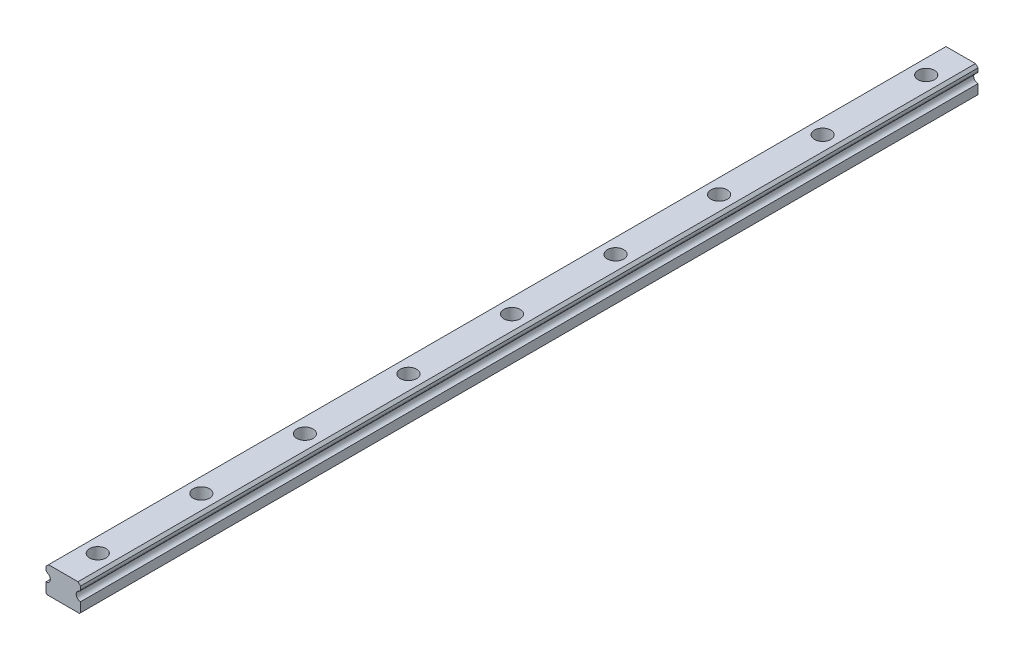
ISO-10303-21;
HEADER;
FILE_DESCRIPTION(('STEP AP214'),'2;1');
FILE_NAME('part.step','',(''),(''),'','','');
FILE_SCHEMA(('AUTOMOTIVE_DESIGN { 1 0 10303 214 1 1 1 1 }'));
ENDSEC;
DATA;
#1=APPLICATION_CONTEXT('core data for automotive mechanical design processes');
#2=APPLICATION_PROTOCOL_DEFINITION('international standard','automotive_design',2000,#1);
#3=PRODUCT_CONTEXT('',#1,'mechanical');
#4=PRODUCT('Part','Part','',(#3));
#5=PRODUCT_RELATED_PRODUCT_CATEGORY('part','',(#4));
#6=PRODUCT_DEFINITION_FORMATION('','',#4);
#7=PRODUCT_DEFINITION_CONTEXT('part definition',#1,'design');
#8=PRODUCT_DEFINITION('design','',#6,#7);
#9=PRODUCT_DEFINITION_SHAPE('','',#8);
#10=(LENGTH_UNIT() NAMED_UNIT(*) SI_UNIT(.MILLI.,.METRE.));
#11=(NAMED_UNIT(*) PLANE_ANGLE_UNIT() SI_UNIT($,.RADIAN.));
#12=(NAMED_UNIT(*) SI_UNIT($,.STERADIAN.) SOLID_ANGLE_UNIT());
#13=UNCERTAINTY_MEASURE_WITH_UNIT(LENGTH_MEASURE(1.E-05),#10,'distance_accuracy_value','');
#14=(GEOMETRIC_REPRESENTATION_CONTEXT(3) GLOBAL_UNCERTAINTY_ASSIGNED_CONTEXT((#13)) GLOBAL_UNIT_ASSIGNED_CONTEXT((#10,
#11,#12)) REPRESENTATION_CONTEXT('',''));
#15=CARTESIAN_POINT('',(0.,0.,0.));
#16=DIRECTION('',(0.,0.,1.));
#17=DIRECTION('',(1.,0.,0.));
#18=AXIS2_PLACEMENT_3D('',#15,#16,#17);
#19=CARTESIAN_POINT('',(-9.99999999999986,8.67999999999979,260.));
#20=DIRECTION('',(0.,0.,-1.));
#21=DIRECTION('',(-1.,0.,0.));
#22=AXIS2_PLACEMENT_3D('',#19,#20,#21);
#23=CYLINDRICAL_SURFACE('',#22,2.49999999999979);
#24=CARTESIAN_POINT('',(-9.99999999999986,8.67999999999979,-260.));
#25=DIRECTION('',(0.,0.,1.));
#26=DIRECTION('',(0.,-1.,0.));
#27=AXIS2_PLACEMENT_3D('',#24,#25,#26);
#28=CIRCLE('',#27,2.49999999999979);
#29=CARTESIAN_POINT('',(-10.,6.18,-260.));
#30=VERTEX_POINT('',#29);
#31=CARTESIAN_POINT('',(-9.0625,10.997562027217,-260.));
#32=VERTEX_POINT('',#31);
#33=EDGE_CURVE('E131',#30,#32,#28,.T.);
#34=ORIENTED_EDGE('',*,*,#33,.F.);
#35=DIRECTION('',(0.,0.,-1.));
#36=VECTOR('',#35,1.);
#37=CARTESIAN_POINT('',(-10.,6.18,260.));
#38=LINE('',#37,#36);
#39=CARTESIAN_POINT('',(-10.,6.18,260.));
#40=VERTEX_POINT('',#39);
#41=EDGE_CURVE('E120',#40,#30,#38,.T.);
#42=ORIENTED_EDGE('',*,*,#41,.F.);
#43=CARTESIAN_POINT('',(-9.99999999999986,8.67999999999979,260.));
#44=DIRECTION('',(0.,0.,1.));
#45=DIRECTION('',(0.,-1.,0.));
#46=AXIS2_PLACEMENT_3D('',#43,#44,#45);
#47=CIRCLE('',#46,2.49999999999979);
#48=CARTESIAN_POINT('',(-9.0625,10.997562027217,260.));
#49=VERTEX_POINT('',#48);
#50=EDGE_CURVE('E130',#40,#49,#47,.T.);
#51=ORIENTED_EDGE('',*,*,#50,.T.);
#52=DIRECTION('',(0.,0.,-1.));
#53=VECTOR('',#52,1.);
#54=CARTESIAN_POINT('',(-9.0625,10.997562027217,260.));
#55=LINE('',#54,#53);
#56=EDGE_CURVE('E143',#49,#32,#55,.T.);
#57=ORIENTED_EDGE('',*,*,#56,.T.);
#58=EDGE_LOOP('',(#34,#42,#51,#57));
#59=FACE_BOUND('',#58,.T.);
#60=ADVANCED_FACE('F16',(#59),#23,.F.);
#61=CARTESIAN_POINT('',(-9.99999999999986,8.67999999999979,-260.));
#62=DIRECTION('',(0.,0.,1.));
#63=DIRECTION('',(1.,0.,0.));
#64=AXIS2_PLACEMENT_3D('',#61,#62,#63);
#65=PLANE('',#64);
#66=ORIENTED_EDGE('',*,*,#33,.T.);
#67=CARTESIAN_POINT('',(-8.50000000000015,12.3880992435473,-260.));
#68=DIRECTION('',(0.,0.,1.));
#69=DIRECTION('',(-1.,4.41720734064239E-13,0.));
#70=AXIS2_PLACEMENT_3D('',#67,#68,#69);
#71=CIRCLE('',#70,1.49999999999985);
#72=CARTESIAN_POINT('',(-10.,12.388099243548,-260.));
#73=VERTEX_POINT('',#72);
#74=EDGE_CURVE('E154',#73,#32,#71,.T.);
#75=ORIENTED_EDGE('',*,*,#74,.F.);
#76=DIRECTION('',(0.,-1.,0.));
#77=VECTOR('',#76,1.);
#78=CARTESIAN_POINT('',(-10.,14.043360030756,-260.));
#79=LINE('',#78,#77);
#80=CARTESIAN_POINT('',(-10.,14.043360030756,-260.));
#81=VERTEX_POINT('',#80);
#82=EDGE_CURVE('E158',#81,#73,#79,.T.);
#83=ORIENTED_EDGE('',*,*,#82,.F.);
#84=DIRECTION('',(-0.70710678118662,-0.707106781186475,0.));
#85=VECTOR('',#84,1.);
#86=CARTESIAN_POINT('',(-8.5433600307557,15.5,-260.));
#87=LINE('',#86,#85);
#88=CARTESIAN_POINT('',(-8.5433600307557,15.5,-260.));
#89=VERTEX_POINT('',#88);
#90=EDGE_CURVE('E162',#89,#81,#87,.T.);
#91=ORIENTED_EDGE('',*,*,#90,.F.);
#92=DIRECTION('',(-1.,0.,0.));
#93=VECTOR('',#92,1.);
#94=CARTESIAN_POINT('',(8.5433600307557,15.5,-260.));
#95=LINE('',#94,#93);
#96=CARTESIAN_POINT('',(8.5433600307557,15.5,-260.));
#97=VERTEX_POINT('',#96);
#98=EDGE_CURVE('E166',#97,#89,#95,.T.);
#99=ORIENTED_EDGE('',*,*,#98,.F.);
#100=DIRECTION('',(-0.70710678118662,0.707106781186475,0.));
#101=VECTOR('',#100,1.);
#102=CARTESIAN_POINT('',(10.,14.043360030756,-260.));
#103=LINE('',#102,#101);
#104=CARTESIAN_POINT('',(10.,14.043360030756,-260.));
#105=VERTEX_POINT('',#104);
#106=EDGE_CURVE('E170',#105,#97,#103,.T.);
#107=ORIENTED_EDGE('',*,*,#106,.F.);
#108=DIRECTION('',(0.,1.,0.));
#109=VECTOR('',#108,1.);
#110=CARTESIAN_POINT('',(10.,12.388099243548,-260.));
#111=LINE('',#110,#109);
#112=CARTESIAN_POINT('',(10.,12.388099243548,-260.));
#113=VERTEX_POINT('',#112);
#114=EDGE_CURVE('E174',#113,#105,#111,.T.);
#115=ORIENTED_EDGE('',*,*,#114,.F.);
#116=CARTESIAN_POINT('',(8.50000000000015,12.3880992435473,-260.));
#117=DIRECTION('',(0.,0.,1.));
#118=DIRECTION('',(0.374999999999937,-0.927024810886984,0.));
#119=AXIS2_PLACEMENT_3D('',#116,#117,#118);
#120=CIRCLE('',#119,1.49999999999985);
#121=CARTESIAN_POINT('',(9.0625,10.997562027217,-260.));
#122=VERTEX_POINT('',#121);
#123=EDGE_CURVE('E178',#122,#113,#120,.T.);
#124=ORIENTED_EDGE('',*,*,#123,.F.);
#125=CARTESIAN_POINT('',(9.99999999999986,8.67999999999978,-260.));
#126=DIRECTION('',(0.,0.,1.));
#127=DIRECTION('',(-0.374999999999976,0.927024810886968,0.));
#128=AXIS2_PLACEMENT_3D('',#125,#126,#127);
#129=CIRCLE('',#128,2.49999999999979);
#130=CARTESIAN_POINT('',(10.,6.18,-260.));
#131=VERTEX_POINT('',#130);
#132=EDGE_CURVE('E182',#122,#131,#129,.T.);
#133=ORIENTED_EDGE('',*,*,#132,.T.);
#134=DIRECTION('',(0.,1.,0.));
#135=VECTOR('',#134,1.);
#136=CARTESIAN_POINT('',(10.,0.6,-260.));
#137=LINE('',#136,#135);
#138=CARTESIAN_POINT('',(10.,0.6,-260.));
#139=VERTEX_POINT('',#138);
#140=EDGE_CURVE('E187',#139,#131,#137,.T.);
#141=ORIENTED_EDGE('',*,*,#140,.F.);
#142=DIRECTION('',(0.707106781186547,0.707106781186548,0.));
#143=VECTOR('',#142,1.);
#144=CARTESIAN_POINT('',(9.4,0.,-260.));
#145=LINE('',#144,#143);
#146=CARTESIAN_POINT('',(9.4,0.,-260.));
#147=VERTEX_POINT('',#146);
#148=EDGE_CURVE('E191',#147,#139,#145,.T.);
#149=ORIENTED_EDGE('',*,*,#148,.F.);
#150=DIRECTION('',(1.,0.,0.));
#151=VECTOR('',#150,1.);
#152=CARTESIAN_POINT('',(-9.4,0.,-260.));
#153=LINE('',#152,#151);
#154=CARTESIAN_POINT('',(-9.4,0.,-260.));
#155=VERTEX_POINT('',#154);
#156=EDGE_CURVE('E195',#155,#147,#153,.T.);
#157=ORIENTED_EDGE('',*,*,#156,.F.);
#158=DIRECTION('',(0.707106781186547,-0.707106781186548,0.));
#159=VECTOR('',#158,1.);
#160=CARTESIAN_POINT('',(-10.,0.6,-260.));
#161=LINE('',#160,#159);
#162=CARTESIAN_POINT('',(-10.,0.6,-260.));
#163=VERTEX_POINT('',#162);
#164=EDGE_CURVE('E139',#163,#155,#161,.T.);
#165=ORIENTED_EDGE('',*,*,#164,.F.);
#166=DIRECTION('',(0.,-1.,0.));
#167=VECTOR('',#166,1.);
#168=CARTESIAN_POINT('',(-10.,6.18,-260.));
#169=LINE('',#168,#167);
#170=EDGE_CURVE('E124',#30,#163,#169,.T.);
#171=ORIENTED_EDGE('',*,*,#170,.F.);
#172=EDGE_LOOP('',(#66,#75,#83,#91,#99,#107,#115,#124,#133,#141,#149,#157,#165,#171));
#173=FACE_BOUND('',#172,.T.);
#174=ADVANCED_FACE('F136',(#173),#65,.F.);
#175=CARTESIAN_POINT('',(-10.,6.18,260.));
#176=DIRECTION('',(1.,0.,0.));
#177=DIRECTION('',(0.,0.,-1.));
#178=AXIS2_PLACEMENT_3D('',#175,#176,#177);
#179=PLANE('',#178);
#180=ORIENTED_EDGE('',*,*,#170,.T.);
#181=DIRECTION('',(0.,0.,-1.));
#182=VECTOR('',#181,1.);
#183=CARTESIAN_POINT('',(-10.,0.6,260.));
#184=LINE('',#183,#182);
#185=CARTESIAN_POINT('',(-10.,0.6,260.));
#186=VERTEX_POINT('',#185);
#187=EDGE_CURVE('E140',#186,#163,#184,.T.);
#188=ORIENTED_EDGE('',*,*,#187,.F.);
#189=DIRECTION('',(0.,-1.,0.));
#190=VECTOR('',#189,1.);
#191=CARTESIAN_POINT('',(-10.,6.18,260.));
#192=LINE('',#191,#190);
#193=EDGE_CURVE('E126',#40,#186,#192,.T.);
#194=ORIENTED_EDGE('',*,*,#193,.F.);
#195=ORIENTED_EDGE('',*,*,#41,.T.);
#196=EDGE_LOOP('',(#180,#188,#194,#195));
#197=FACE_BOUND('',#196,.T.);
#198=ADVANCED_FACE('F122',(#197),#179,.F.);
#199=CARTESIAN_POINT('',(-9.99999999999986,8.67999999999979,260.));
#200=DIRECTION('',(0.,0.,1.));
#201=DIRECTION('',(1.,0.,0.));
#202=AXIS2_PLACEMENT_3D('',#199,#200,#201);
#203=PLANE('',#202);
#204=ORIENTED_EDGE('',*,*,#50,.F.);
#205=ORIENTED_EDGE('',*,*,#193,.T.);
#206=DIRECTION('',(0.707106781186547,-0.707106781186548,0.));
#207=VECTOR('',#206,1.);
#208=CARTESIAN_POINT('',(-10.,0.6,260.));
#209=LINE('',#208,#207);
#210=CARTESIAN_POINT('',(-9.4,0.,260.));
#211=VERTEX_POINT('',#210);
#212=EDGE_CURVE('E210',#186,#211,#209,.T.);
#213=ORIENTED_EDGE('',*,*,#212,.T.);
#214=DIRECTION('',(1.,0.,0.));
#215=VECTOR('',#214,1.);
#216=CARTESIAN_POINT('',(-9.4,0.,260.));
#217=LINE('',#216,#215);
#218=CARTESIAN_POINT('',(9.4,0.,260.));
#219=VERTEX_POINT('',#218);
#220=EDGE_CURVE('E215',#211,#219,#217,.T.);
#221=ORIENTED_EDGE('',*,*,#220,.T.);
#222=DIRECTION('',(0.707106781186547,0.707106781186548,0.));
#223=VECTOR('',#222,1.);
#224=CARTESIAN_POINT('',(9.4,0.,260.));
#225=LINE('',#224,#223);
#226=CARTESIAN_POINT('',(10.,0.6,260.));
#227=VERTEX_POINT('',#226);
#228=EDGE_CURVE('E220',#219,#227,#225,.T.);
#229=ORIENTED_EDGE('',*,*,#228,.T.);
#230=DIRECTION('',(0.,1.,0.));
#231=VECTOR('',#230,1.);
#232=CARTESIAN_POINT('',(10.,0.6,260.));
#233=LINE('',#232,#231);
#234=CARTESIAN_POINT('',(10.,6.18,260.));
#235=VERTEX_POINT('',#234);
#236=EDGE_CURVE('E225',#227,#235,#233,.T.);
#237=ORIENTED_EDGE('',*,*,#236,.T.);
#238=CARTESIAN_POINT('',(9.99999999999986,8.67999999999978,260.));
#239=DIRECTION('',(0.,0.,1.));
#240=DIRECTION('',(-0.374999999999976,0.927024810886968,0.));
#241=AXIS2_PLACEMENT_3D('',#238,#239,#240);
#242=CIRCLE('',#241,2.49999999999979);
#243=CARTESIAN_POINT('',(9.0625,10.997562027217,260.));
#244=VERTEX_POINT('',#243);
#245=EDGE_CURVE('E230',#244,#235,#242,.T.);
#246=ORIENTED_EDGE('',*,*,#245,.F.);
#247=CARTESIAN_POINT('',(8.50000000000015,12.3880992435473,260.));
#248=DIRECTION('',(0.,0.,1.));
#249=DIRECTION('',(0.374999999999937,-0.927024810886984,0.));
#250=AXIS2_PLACEMENT_3D('',#247,#248,#249);
#251=CIRCLE('',#250,1.49999999999985);
#252=CARTESIAN_POINT('',(10.,12.388099243548,260.));
#253=VERTEX_POINT('',#252);
#254=EDGE_CURVE('E235',#244,#253,#251,.T.);
#255=ORIENTED_EDGE('',*,*,#254,.T.);
#256=DIRECTION('',(0.,1.,0.));
#257=VECTOR('',#256,1.);
#258=CARTESIAN_POINT('',(10.,12.388099243548,260.));
#259=LINE('',#258,#257);
#260=CARTESIAN_POINT('',(10.,14.043360030756,260.));
#261=VERTEX_POINT('',#260);
#262=EDGE_CURVE('E240',#253,#261,#259,.T.);
#263=ORIENTED_EDGE('',*,*,#262,.T.);
#264=DIRECTION('',(-0.70710678118662,0.707106781186475,0.));
#265=VECTOR('',#264,1.);
#266=CARTESIAN_POINT('',(10.,14.043360030756,260.));
#267=LINE('',#266,#265);
#268=CARTESIAN_POINT('',(8.5433600307557,15.5,260.));
#269=VERTEX_POINT('',#268);
#270=EDGE_CURVE('E245',#261,#269,#267,.T.);
#271=ORIENTED_EDGE('',*,*,#270,.T.);
#272=DIRECTION('',(-1.,0.,0.));
#273=VECTOR('',#272,1.);
#274=CARTESIAN_POINT('',(8.5433600307557,15.5,260.));
#275=LINE('',#274,#273);
#276=CARTESIAN_POINT('',(-8.5433600307557,15.5,260.));
#277=VERTEX_POINT('',#276);
#278=EDGE_CURVE('E250',#269,#277,#275,.T.);
#279=ORIENTED_EDGE('',*,*,#278,.T.);
#280=DIRECTION('',(-0.70710678118662,-0.707106781186475,0.));
#281=VECTOR('',#280,1.);
#282=CARTESIAN_POINT('',(-8.5433600307557,15.5,260.));
#283=LINE('',#282,#281);
#284=CARTESIAN_POINT('',(-10.,14.043360030756,260.));
#285=VERTEX_POINT('',#284);
#286=EDGE_CURVE('E255',#277,#285,#283,.T.);
#287=ORIENTED_EDGE('',*,*,#286,.T.);
#288=DIRECTION('',(0.,-1.,0.));
#289=VECTOR('',#288,1.);
#290=CARTESIAN_POINT('',(-10.,14.043360030756,260.));
#291=LINE('',#290,#289);
#292=CARTESIAN_POINT('',(-10.,12.388099243548,260.));
#293=VERTEX_POINT('',#292);
#294=EDGE_CURVE('E259',#285,#293,#291,.T.);
#295=ORIENTED_EDGE('',*,*,#294,.T.);
#296=CARTESIAN_POINT('',(-8.50000000000015,12.3880992435473,260.));
#297=DIRECTION('',(0.,0.,1.));
#298=DIRECTION('',(-1.,4.41720734064239E-13,0.));
#299=AXIS2_PLACEMENT_3D('',#296,#297,#298);
#300=CIRCLE('',#299,1.49999999999985);
#301=EDGE_CURVE('E263',#293,#49,#300,.T.);
#302=ORIENTED_EDGE('',*,*,#301,.T.);
#303=EDGE_LOOP('',(#204,#205,#213,#221,#229,#237,#246,#255,#263,#271,#279,#287,#295,#302));
#304=FACE_BOUND('',#303,.T.);
#305=ADVANCED_FACE('F454',(#304),#203,.T.);
#306=CARTESIAN_POINT('',(-8.50000000000015,12.3880992435473,260.));
#307=DIRECTION('',(0.,0.,-1.));
#308=DIRECTION('',(-1.,0.,0.));
#309=AXIS2_PLACEMENT_3D('',#306,#307,#308);
#310=CYLINDRICAL_SURFACE('',#309,1.49999999999985);
#311=ORIENTED_EDGE('',*,*,#74,.T.);
#312=ORIENTED_EDGE('',*,*,#56,.F.);
#313=ORIENTED_EDGE('',*,*,#301,.F.);
#314=DIRECTION('',(0.,0.,-1.));
#315=VECTOR('',#314,1.);
#316=CARTESIAN_POINT('',(-10.,12.388099243548,260.));
#317=LINE('',#316,#315);
#318=EDGE_CURVE('E31',#293,#73,#317,.T.);
#319=ORIENTED_EDGE('',*,*,#318,.T.);
#320=EDGE_LOOP('',(#311,#312,#313,#319));
#321=FACE_BOUND('',#320,.T.);
#322=ADVANCED_FACE('F457',(#321),#310,.T.);
#323=CARTESIAN_POINT('',(-10.,14.043360030756,260.));
#324=DIRECTION('',(1.,0.,0.));
#325=DIRECTION('',(0.,0.,-1.));
#326=AXIS2_PLACEMENT_3D('',#323,#324,#325);
#327=PLANE('',#326);
#328=ORIENTED_EDGE('',*,*,#82,.T.);
#329=ORIENTED_EDGE('',*,*,#318,.F.);
#330=ORIENTED_EDGE('',*,*,#294,.F.);
#331=DIRECTION('',(0.,0.,-1.));
#332=VECTOR('',#331,1.);
#333=CARTESIAN_POINT('',(-10.,14.043360030756,260.));
#334=LINE('',#333,#332);
#335=EDGE_CURVE('E39',#285,#81,#334,.T.);
#336=ORIENTED_EDGE('',*,*,#335,.T.);
#337=EDGE_LOOP('',(#328,#329,#330,#336));
#338=FACE_BOUND('',#337,.T.);
#339=ADVANCED_FACE('F461',(#338),#327,.F.);
#340=CARTESIAN_POINT('',(-8.5433600307557,15.5,260.));
#341=DIRECTION('',(0.707106781186475,-0.70710678118662,0.));
#342=DIRECTION('',(0.70710678118662,0.707106781186475,0.));
#343=AXIS2_PLACEMENT_3D('',#340,#341,#342);
#344=PLANE('',#343);
#345=ORIENTED_EDGE('',*,*,#90,.T.);
#346=ORIENTED_EDGE('',*,*,#335,.F.);
#347=ORIENTED_EDGE('',*,*,#286,.F.);
#348=DIRECTION('',(0.,0.,-1.));
#349=VECTOR('',#348,1.);
#350=CARTESIAN_POINT('',(-8.5433600307557,15.5,260.));
#351=LINE('',#350,#349);
#352=EDGE_CURVE('E274',#277,#89,#351,.T.);
#353=ORIENTED_EDGE('',*,*,#352,.T.);
#354=EDGE_LOOP('',(#345,#346,#347,#353));
#355=FACE_BOUND('',#354,.T.);
#356=ADVANCED_FACE('F465',(#355),#344,.F.);
#357=CARTESIAN_POINT('',(8.5433600307557,15.5,260.));
#358=DIRECTION('',(0.,-1.,0.));
#359=DIRECTION('',(0.,0.,-1.));
#360=AXIS2_PLACEMENT_3D('',#357,#358,#359);
#361=PLANE('',#360);
#362=CARTESIAN_POINT('',(0.,15.5,-180.));
#363=DIRECTION('',(0.,-1.,0.));
#364=DIRECTION('',(0.,0.,-1.));
#365=AXIS2_PLACEMENT_3D('',#362,#363,#364);
#366=CIRCLE('',#365,4.75);
#367=CARTESIAN_POINT('',(0.,15.5,-184.75));
#368=VERTEX_POINT('',#367);
#369=EDGE_CURVE('E279',#368,#368,#366,.T.);
#370=ORIENTED_EDGE('',*,*,#369,.T.);
#371=EDGE_LOOP('',(#370));
#372=FACE_BOUND('',#371,.T.);
#373=CARTESIAN_POINT('',(0.,15.5,-120.));
#374=DIRECTION('',(0.,-1.,0.));
#375=DIRECTION('',(0.,0.,-1.));
#376=AXIS2_PLACEMENT_3D('',#373,#374,#375);
#377=CIRCLE('',#376,4.75);
#378=CARTESIAN_POINT('',(0.,15.5,-124.75));
#379=VERTEX_POINT('',#378);
#380=EDGE_CURVE('E284',#379,#379,#377,.T.);
#381=ORIENTED_EDGE('',*,*,#380,.T.);
#382=EDGE_LOOP('',(#381));
#383=FACE_BOUND('',#382,.T.);
#384=CARTESIAN_POINT('',(0.,15.5,-60.));
#385=DIRECTION('',(0.,-1.,0.));
#386=DIRECTION('',(0.,0.,-1.));
#387=AXIS2_PLACEMENT_3D('',#384,#385,#386);
#388=CIRCLE('',#387,4.75);
#389=CARTESIAN_POINT('',(0.,15.5,-64.75));
#390=VERTEX_POINT('',#389);
#391=EDGE_CURVE('E287',#390,#390,#388,.T.);
#392=ORIENTED_EDGE('',*,*,#391,.T.);
#393=EDGE_LOOP('',(#392));
#394=FACE_BOUND('',#393,.T.);
#395=CARTESIAN_POINT('',(0.,15.5,0.));
#396=DIRECTION('',(0.,-1.,0.));
#397=DIRECTION('',(0.,0.,-1.));
#398=AXIS2_PLACEMENT_3D('',#395,#396,#397);
#399=CIRCLE('',#398,4.75);
#400=CARTESIAN_POINT('',(0.,15.5,-4.75));
#401=VERTEX_POINT('',#400);
#402=EDGE_CURVE('E290',#401,#401,#399,.T.);
#403=ORIENTED_EDGE('',*,*,#402,.T.);
#404=EDGE_LOOP('',(#403));
#405=FACE_BOUND('',#404,.T.);
#406=CARTESIAN_POINT('',(0.,15.5,60.));
#407=DIRECTION('',(0.,-1.,0.));
#408=DIRECTION('',(0.,0.,-1.));
#409=AXIS2_PLACEMENT_3D('',#406,#407,#408);
#410=CIRCLE('',#409,4.75);
#411=CARTESIAN_POINT('',(0.,15.5,55.25));
#412=VERTEX_POINT('',#411);
#413=EDGE_CURVE('E293',#412,#412,#410,.T.);
#414=ORIENTED_EDGE('',*,*,#413,.T.);
#415=EDGE_LOOP('',(#414));
#416=FACE_BOUND('',#415,.T.);
#417=CARTESIAN_POINT('',(0.,15.5,120.));
#418=DIRECTION('',(0.,-1.,0.));
#419=DIRECTION('',(0.,0.,-1.));
#420=AXIS2_PLACEMENT_3D('',#417,#418,#419);
#421=CIRCLE('',#420,4.75);
#422=CARTESIAN_POINT('',(0.,15.5,115.25));
#423=VERTEX_POINT('',#422);
#424=EDGE_CURVE('E296',#423,#423,#421,.T.);
#425=ORIENTED_EDGE('',*,*,#424,.T.);
#426=EDGE_LOOP('',(#425));
#427=FACE_BOUND('',#426,.T.);
#428=CARTESIAN_POINT('',(0.,15.5,180.));
#429=DIRECTION('',(0.,-1.,0.));
#430=DIRECTION('',(0.,0.,-1.));
#431=AXIS2_PLACEMENT_3D('',#428,#429,#430);
#432=CIRCLE('',#431,4.75);
#433=CARTESIAN_POINT('',(0.,15.5,175.25));
#434=VERTEX_POINT('',#433);
#435=EDGE_CURVE('E299',#434,#434,#432,.T.);
#436=ORIENTED_EDGE('',*,*,#435,.T.);
#437=EDGE_LOOP('',(#436));
#438=FACE_BOUND('',#437,.T.);
#439=CARTESIAN_POINT('',(0.,15.5,240.));
#440=DIRECTION('',(0.,-1.,0.));
#441=DIRECTION('',(0.,0.,-1.));
#442=AXIS2_PLACEMENT_3D('',#439,#440,#441);
#443=CIRCLE('',#442,4.75);
#444=CARTESIAN_POINT('',(0.,15.5,235.25));
#445=VERTEX_POINT('',#444);
#446=EDGE_CURVE('E302',#445,#445,#443,.T.);
#447=ORIENTED_EDGE('',*,*,#446,.T.);
#448=EDGE_LOOP('',(#447));
#449=FACE_BOUND('',#448,.T.);
#450=CARTESIAN_POINT('',(0.,15.5,-240.));
#451=DIRECTION('',(0.,-1.,0.));
#452=DIRECTION('',(0.,0.,-1.));
#453=AXIS2_PLACEMENT_3D('',#450,#451,#452);
#454=CIRCLE('',#453,4.75);
#455=CARTESIAN_POINT('',(0.,15.5,-244.75));
#456=VERTEX_POINT('',#455);
#457=EDGE_CURVE('E305',#456,#456,#454,.T.);
#458=ORIENTED_EDGE('',*,*,#457,.T.);
#459=EDGE_LOOP('',(#458));
#460=FACE_BOUND('',#459,.T.);
#461=ORIENTED_EDGE('',*,*,#98,.T.);
#462=ORIENTED_EDGE('',*,*,#352,.F.);
#463=ORIENTED_EDGE('',*,*,#278,.F.);
#464=DIRECTION('',(0.,0.,-1.));
#465=VECTOR('',#464,1.);
#466=CARTESIAN_POINT('',(8.5433600307557,15.5,260.));
#467=LINE('',#466,#465);
#468=EDGE_CURVE('E308',#269,#97,#467,.T.);
#469=ORIENTED_EDGE('',*,*,#468,.T.);
#470=EDGE_LOOP('',(#461,#462,#463,#469));
#471=FACE_BOUND('',#470,.T.);
#472=ADVANCED_FACE('F468',(#372,#383,#394,#405,#416,#427,#438,#449,#460,#471),#361,.F.);
#473=CARTESIAN_POINT('',(10.,14.043360030756,260.));
#474=DIRECTION('',(-0.707106781186475,-0.70710678118662,0.));
#475=DIRECTION('',(0.70710678118662,-0.707106781186475,0.));
#476=AXIS2_PLACEMENT_3D('',#473,#474,#475);
#477=PLANE('',#476);
#478=ORIENTED_EDGE('',*,*,#106,.T.);
#479=ORIENTED_EDGE('',*,*,#468,.F.);
#480=ORIENTED_EDGE('',*,*,#270,.F.);
#481=DIRECTION('',(0.,0.,-1.));
#482=VECTOR('',#481,1.);
#483=CARTESIAN_POINT('',(10.,14.043360030756,260.));
#484=LINE('',#483,#482);
#485=EDGE_CURVE('E311',#261,#105,#484,.T.);
#486=ORIENTED_EDGE('',*,*,#485,.T.);
#487=EDGE_LOOP('',(#478,#479,#480,#486));
#488=FACE_BOUND('',#487,.T.);
#489=ADVANCED_FACE('F471',(#488),#477,.F.);
#490=CARTESIAN_POINT('',(10.,12.388099243548,260.));
#491=DIRECTION('',(-1.,0.,0.));
#492=DIRECTION('',(0.,0.,1.));
#493=AXIS2_PLACEMENT_3D('',#490,#491,#492);
#494=PLANE('',#493);
#495=ORIENTED_EDGE('',*,*,#114,.T.);
#496=ORIENTED_EDGE('',*,*,#485,.F.);
#497=ORIENTED_EDGE('',*,*,#262,.F.);
#498=DIRECTION('',(0.,0.,-1.));
#499=VECTOR('',#498,1.);
#500=CARTESIAN_POINT('',(10.,12.388099243548,260.));
#501=LINE('',#500,#499);
#502=EDGE_CURVE('E316',#253,#113,#501,.T.);
#503=ORIENTED_EDGE('',*,*,#502,.T.);
#504=EDGE_LOOP('',(#495,#496,#497,#503));
#505=FACE_BOUND('',#504,.T.);
#506=ADVANCED_FACE('F475',(#505),#494,.F.);
#507=CARTESIAN_POINT('',(8.50000000000015,12.3880992435473,260.));
#508=DIRECTION('',(0.,0.,-1.));
#509=DIRECTION('',(-1.,0.,0.));
#510=AXIS2_PLACEMENT_3D('',#507,#508,#509);
#511=CYLINDRICAL_SURFACE('',#510,1.49999999999985);
#512=ORIENTED_EDGE('',*,*,#123,.T.);
#513=ORIENTED_EDGE('',*,*,#502,.F.);
#514=ORIENTED_EDGE('',*,*,#254,.F.);
#515=DIRECTION('',(0.,0.,-1.));
#516=VECTOR('',#515,1.);
#517=CARTESIAN_POINT('',(9.0625,10.997562027217,260.));
#518=LINE('',#517,#516);
#519=EDGE_CURVE('E321',#244,#122,#518,.T.);
#520=ORIENTED_EDGE('',*,*,#519,.T.);
#521=EDGE_LOOP('',(#512,#513,#514,#520));
#522=FACE_BOUND('',#521,.T.);
#523=ADVANCED_FACE('F479',(#522),#511,.T.);
#524=CARTESIAN_POINT('',(9.99999999999986,8.67999999999978,260.));
#525=DIRECTION('',(0.,0.,-1.));
#526=DIRECTION('',(-1.,0.,0.));
#527=AXIS2_PLACEMENT_3D('',#524,#525,#526);
#528=CYLINDRICAL_SURFACE('',#527,2.49999999999979);
#529=ORIENTED_EDGE('',*,*,#132,.F.);
#530=ORIENTED_EDGE('',*,*,#519,.F.);
#531=ORIENTED_EDGE('',*,*,#245,.T.);
#532=DIRECTION('',(0.,0.,-1.));
#533=VECTOR('',#532,1.);
#534=CARTESIAN_POINT('',(10.,6.18,260.));
#535=LINE('',#534,#533);
#536=EDGE_CURVE('E326',#235,#131,#535,.T.);
#537=ORIENTED_EDGE('',*,*,#536,.T.);
#538=EDGE_LOOP('',(#529,#530,#531,#537));
#539=FACE_BOUND('',#538,.T.);
#540=ADVANCED_FACE('F483',(#539),#528,.F.);
#541=CARTESIAN_POINT('',(10.,0.6,260.));
#542=DIRECTION('',(-1.,0.,0.));
#543=DIRECTION('',(0.,0.,1.));
#544=AXIS2_PLACEMENT_3D('',#541,#542,#543);
#545=PLANE('',#544);
#546=ORIENTED_EDGE('',*,*,#140,.T.);
#547=ORIENTED_EDGE('',*,*,#536,.F.);
#548=ORIENTED_EDGE('',*,*,#236,.F.);
#549=DIRECTION('',(0.,0.,-1.));
#550=VECTOR('',#549,1.);
#551=CARTESIAN_POINT('',(10.,0.6,260.));
#552=LINE('',#551,#550);
#553=EDGE_CURVE('E331',#227,#139,#552,.T.);
#554=ORIENTED_EDGE('',*,*,#553,.T.);
#555=EDGE_LOOP('',(#546,#547,#548,#554));
#556=FACE_BOUND('',#555,.T.);
#557=ADVANCED_FACE('F487',(#556),#545,.F.);
#558=CARTESIAN_POINT('',(9.4,0.,260.));
#559=DIRECTION('',(-0.707106781186548,0.707106781186548,0.));
#560=DIRECTION('',(-0.707106781186548,-0.707106781186548,0.));
#561=AXIS2_PLACEMENT_3D('',#558,#559,#560);
#562=PLANE('',#561);
#563=ORIENTED_EDGE('',*,*,#148,.T.);
#564=ORIENTED_EDGE('',*,*,#553,.F.);
#565=ORIENTED_EDGE('',*,*,#228,.F.);
#566=DIRECTION('',(0.,0.,-1.));
#567=VECTOR('',#566,1.);
#568=CARTESIAN_POINT('',(9.4,0.,260.));
#569=LINE('',#568,#567);
#570=EDGE_CURVE('E336',#219,#147,#569,.T.);
#571=ORIENTED_EDGE('',*,*,#570,.T.);
#572=EDGE_LOOP('',(#563,#564,#565,#571));
#573=FACE_BOUND('',#572,.T.);
#574=ADVANCED_FACE('F491',(#573),#562,.F.);
#575=CARTESIAN_POINT('',(-9.4,0.,260.));
#576=DIRECTION('',(0.,1.,0.));
#577=DIRECTION('',(0.,0.,1.));
#578=AXIS2_PLACEMENT_3D('',#575,#576,#577);
#579=PLANE('',#578);
#580=CARTESIAN_POINT('',(0.,0.,-180.));
#581=DIRECTION('',(0.,-1.,0.));
#582=DIRECTION('',(0.,0.,-1.));
#583=AXIS2_PLACEMENT_3D('',#580,#581,#582);
#584=CIRCLE('',#583,3.);
#585=CARTESIAN_POINT('',(0.,0.,-183.));
#586=VERTEX_POINT('',#585);
#587=EDGE_CURVE('E341',#586,#586,#584,.T.);
#588=ORIENTED_EDGE('',*,*,#587,.F.);
#589=EDGE_LOOP('',(#588));
#590=FACE_BOUND('',#589,.T.);
#591=CARTESIAN_POINT('',(0.,0.,-120.));
#592=DIRECTION('',(0.,-1.,0.));
#593=DIRECTION('',(0.,0.,-1.));
#594=AXIS2_PLACEMENT_3D('',#591,#592,#593);
#595=CIRCLE('',#594,3.);
#596=CARTESIAN_POINT('',(0.,0.,-123.));
#597=VERTEX_POINT('',#596);
#598=EDGE_CURVE('E346',#597,#597,#595,.T.);
#599=ORIENTED_EDGE('',*,*,#598,.F.);
#600=EDGE_LOOP('',(#599));
#601=FACE_BOUND('',#600,.T.);
#602=CARTESIAN_POINT('',(0.,0.,-60.));
#603=DIRECTION('',(0.,-1.,0.));
#604=DIRECTION('',(0.,0.,-1.));
#605=AXIS2_PLACEMENT_3D('',#602,#603,#604);
#606=CIRCLE('',#605,3.);
#607=CARTESIAN_POINT('',(0.,0.,-63.));
#608=VERTEX_POINT('',#607);
#609=EDGE_CURVE('E349',#608,#608,#606,.T.);
#610=ORIENTED_EDGE('',*,*,#609,.F.);
#611=EDGE_LOOP('',(#610));
#612=FACE_BOUND('',#611,.T.);
#613=CARTESIAN_POINT('',(0.,0.,0.));
#614=DIRECTION('',(0.,-1.,0.));
#615=DIRECTION('',(0.,0.,-1.));
#616=AXIS2_PLACEMENT_3D('',#613,#614,#615);
#617=CIRCLE('',#616,3.);
#618=CARTESIAN_POINT('',(0.,0.,-3.));
#619=VERTEX_POINT('',#618);
#620=EDGE_CURVE('E352',#619,#619,#617,.T.);
#621=ORIENTED_EDGE('',*,*,#620,.F.);
#622=EDGE_LOOP('',(#621));
#623=FACE_BOUND('',#622,.T.);
#624=CARTESIAN_POINT('',(0.,0.,60.));
#625=DIRECTION('',(0.,-1.,0.));
#626=DIRECTION('',(0.,0.,-1.));
#627=AXIS2_PLACEMENT_3D('',#624,#625,#626);
#628=CIRCLE('',#627,3.);
#629=CARTESIAN_POINT('',(0.,0.,57.));
#630=VERTEX_POINT('',#629);
#631=EDGE_CURVE('E355',#630,#630,#628,.T.);
#632=ORIENTED_EDGE('',*,*,#631,.F.);
#633=EDGE_LOOP('',(#632));
#634=FACE_BOUND('',#633,.T.);
#635=CARTESIAN_POINT('',(0.,0.,120.));
#636=DIRECTION('',(0.,-1.,0.));
#637=DIRECTION('',(0.,0.,-1.));
#638=AXIS2_PLACEMENT_3D('',#635,#636,#637);
#639=CIRCLE('',#638,3.);
#640=CARTESIAN_POINT('',(0.,0.,117.));
#641=VERTEX_POINT('',#640);
#642=EDGE_CURVE('E358',#641,#641,#639,.T.);
#643=ORIENTED_EDGE('',*,*,#642,.F.);
#644=EDGE_LOOP('',(#643));
#645=FACE_BOUND('',#644,.T.);
#646=CARTESIAN_POINT('',(0.,0.,180.));
#647=DIRECTION('',(0.,-1.,0.));
#648=DIRECTION('',(0.,0.,-1.));
#649=AXIS2_PLACEMENT_3D('',#646,#647,#648);
#650=CIRCLE('',#649,3.);
#651=CARTESIAN_POINT('',(0.,0.,177.));
#652=VERTEX_POINT('',#651);
#653=EDGE_CURVE('E361',#652,#652,#650,.T.);
#654=ORIENTED_EDGE('',*,*,#653,.F.);
#655=EDGE_LOOP('',(#654));
#656=FACE_BOUND('',#655,.T.);
#657=CARTESIAN_POINT('',(0.,0.,240.));
#658=DIRECTION('',(0.,-1.,0.));
#659=DIRECTION('',(0.,0.,-1.));
#660=AXIS2_PLACEMENT_3D('',#657,#658,#659);
#661=CIRCLE('',#660,3.);
#662=CARTESIAN_POINT('',(0.,0.,237.));
#663=VERTEX_POINT('',#662);
#664=EDGE_CURVE('E364',#663,#663,#661,.T.);
#665=ORIENTED_EDGE('',*,*,#664,.F.);
#666=EDGE_LOOP('',(#665));
#667=FACE_BOUND('',#666,.T.);
#668=CARTESIAN_POINT('',(0.,0.,-240.));
#669=DIRECTION('',(0.,-1.,0.));
#670=DIRECTION('',(0.,0.,-1.));
#671=AXIS2_PLACEMENT_3D('',#668,#669,#670);
#672=CIRCLE('',#671,3.);
#673=CARTESIAN_POINT('',(0.,0.,-243.));
#674=VERTEX_POINT('',#673);
#675=EDGE_CURVE('E367',#674,#674,#672,.T.);
#676=ORIENTED_EDGE('',*,*,#675,.F.);
#677=EDGE_LOOP('',(#676));
#678=FACE_BOUND('',#677,.T.);
#679=ORIENTED_EDGE('',*,*,#156,.T.);
#680=ORIENTED_EDGE('',*,*,#570,.F.);
#681=ORIENTED_EDGE('',*,*,#220,.F.);
#682=DIRECTION('',(0.,0.,-1.));
#683=VECTOR('',#682,1.);
#684=CARTESIAN_POINT('',(-9.4,0.,260.));
#685=LINE('',#684,#683);
#686=EDGE_CURVE('E370',#211,#155,#685,.T.);
#687=ORIENTED_EDGE('',*,*,#686,.T.);
#688=EDGE_LOOP('',(#679,#680,#681,#687));
#689=FACE_BOUND('',#688,.T.);
#690=ADVANCED_FACE('F495',(#590,#601,#612,#623,#634,#645,#656,#667,#678,#689),#579,.F.);
#691=CARTESIAN_POINT('',(-10.,0.6,260.));
#692=DIRECTION('',(0.707106781186548,0.707106781186548,0.));
#693=DIRECTION('',(-0.707106781186548,0.707106781186548,0.));
#694=AXIS2_PLACEMENT_3D('',#691,#692,#693);
#695=PLANE('',#694);
#696=ORIENTED_EDGE('',*,*,#164,.T.);
#697=ORIENTED_EDGE('',*,*,#686,.F.);
#698=ORIENTED_EDGE('',*,*,#212,.F.);
#699=ORIENTED_EDGE('',*,*,#187,.T.);
#700=EDGE_LOOP('',(#696,#697,#698,#699));
#701=FACE_BOUND('',#700,.T.);
#702=ADVANCED_FACE('F499',(#701),#695,.F.);
#703=CARTESIAN_POINT('',(0.,0.,-180.));
#704=DIRECTION('',(0.,-1.,0.));
#705=DIRECTION('',(0.,0.,-1.));
#706=AXIS2_PLACEMENT_3D('',#703,#704,#705);
#707=CYLINDRICAL_SURFACE('',#706,4.75);
#708=CARTESIAN_POINT('',(0.,7.,-180.));
#709=DIRECTION('',(0.,-1.,0.));
#710=DIRECTION('',(0.,0.,-1.));
#711=AXIS2_PLACEMENT_3D('',#708,#709,#710);
#712=CIRCLE('',#711,4.75);
#713=CARTESIAN_POINT('',(0.,7.,-184.75));
#714=VERTEX_POINT('',#713);
#715=EDGE_CURVE('E373',#714,#714,#712,.T.);
#716=ORIENTED_EDGE('',*,*,#715,.T.);
#717=EDGE_LOOP('',(#716));
#718=FACE_BOUND('',#717,.T.);
#719=ORIENTED_EDGE('',*,*,#369,.F.);
#720=EDGE_LOOP('',(#719));
#721=FACE_BOUND('',#720,.T.);
#722=ADVANCED_FACE('F503',(#718,#721),#707,.F.);
#723=CARTESIAN_POINT('',(0.,0.,-120.));
#724=DIRECTION('',(0.,-1.,0.));
#725=DIRECTION('',(0.,0.,-1.));
#726=AXIS2_PLACEMENT_3D('',#723,#724,#725);
#727=CYLINDRICAL_SURFACE('',#726,4.75);
#728=CARTESIAN_POINT('',(0.,7.,-120.));
#729=DIRECTION('',(0.,-1.,0.));
#730=DIRECTION('',(0.,0.,-1.));
#731=AXIS2_PLACEMENT_3D('',#728,#729,#730);
#732=CIRCLE('',#731,4.75);
#733=CARTESIAN_POINT('',(0.,7.,-124.75));
#734=VERTEX_POINT('',#733);
#735=EDGE_CURVE('E378',#734,#734,#732,.T.);
#736=ORIENTED_EDGE('',*,*,#735,.T.);
#737=EDGE_LOOP('',(#736));
#738=FACE_BOUND('',#737,.T.);
#739=ORIENTED_EDGE('',*,*,#380,.F.);
#740=EDGE_LOOP('',(#739));
#741=FACE_BOUND('',#740,.T.);
#742=ADVANCED_FACE('F507',(#738,#741),#727,.F.);
#743=CARTESIAN_POINT('',(0.,0.,-60.));
#744=DIRECTION('',(0.,-1.,0.));
#745=DIRECTION('',(0.,0.,-1.));
#746=AXIS2_PLACEMENT_3D('',#743,#744,#745);
#747=CYLINDRICAL_SURFACE('',#746,4.75);
#748=CARTESIAN_POINT('',(0.,7.,-60.));
#749=DIRECTION('',(0.,-1.,0.));
#750=DIRECTION('',(0.,0.,-1.));
#751=AXIS2_PLACEMENT_3D('',#748,#749,#750);
#752=CIRCLE('',#751,4.75);
#753=CARTESIAN_POINT('',(0.,7.,-64.75));
#754=VERTEX_POINT('',#753);
#755=EDGE_CURVE('E381',#754,#754,#752,.T.);
#756=ORIENTED_EDGE('',*,*,#755,.T.);
#757=EDGE_LOOP('',(#756));
#758=FACE_BOUND('',#757,.T.);
#759=ORIENTED_EDGE('',*,*,#391,.F.);
#760=EDGE_LOOP('',(#759));
#761=FACE_BOUND('',#760,.T.);
#762=ADVANCED_FACE('F511',(#758,#761),#747,.F.);
#763=CARTESIAN_POINT('',(0.,0.,0.));
#764=DIRECTION('',(0.,-1.,0.));
#765=DIRECTION('',(0.,0.,-1.));
#766=AXIS2_PLACEMENT_3D('',#763,#764,#765);
#767=CYLINDRICAL_SURFACE('',#766,4.75);
#768=CARTESIAN_POINT('',(0.,7.,0.));
#769=DIRECTION('',(0.,-1.,0.));
#770=DIRECTION('',(0.,0.,-1.));
#771=AXIS2_PLACEMENT_3D('',#768,#769,#770);
#772=CIRCLE('',#771,4.75);
#773=CARTESIAN_POINT('',(0.,7.,-4.75));
#774=VERTEX_POINT('',#773);
#775=EDGE_CURVE('E384',#774,#774,#772,.T.);
#776=ORIENTED_EDGE('',*,*,#775,.T.);
#777=EDGE_LOOP('',(#776));
#778=FACE_BOUND('',#777,.T.);
#779=ORIENTED_EDGE('',*,*,#402,.F.);
#780=EDGE_LOOP('',(#779));
#781=FACE_BOUND('',#780,.T.);
#782=ADVANCED_FACE('F515',(#778,#781),#767,.F.);
#783=CARTESIAN_POINT('',(0.,0.,60.));
#784=DIRECTION('',(0.,-1.,0.));
#785=DIRECTION('',(0.,0.,-1.));
#786=AXIS2_PLACEMENT_3D('',#783,#784,#785);
#787=CYLINDRICAL_SURFACE('',#786,4.75);
#788=CARTESIAN_POINT('',(0.,7.,60.));
#789=DIRECTION('',(0.,-1.,0.));
#790=DIRECTION('',(0.,0.,-1.));
#791=AXIS2_PLACEMENT_3D('',#788,#789,#790);
#792=CIRCLE('',#791,4.75);
#793=CARTESIAN_POINT('',(0.,7.,55.25));
#794=VERTEX_POINT('',#793);
#795=EDGE_CURVE('E387',#794,#794,#792,.T.);
#796=ORIENTED_EDGE('',*,*,#795,.T.);
#797=EDGE_LOOP('',(#796));
#798=FACE_BOUND('',#797,.T.);
#799=ORIENTED_EDGE('',*,*,#413,.F.);
#800=EDGE_LOOP('',(#799));
#801=FACE_BOUND('',#800,.T.);
#802=ADVANCED_FACE('F519',(#798,#801),#787,.F.);
#803=CARTESIAN_POINT('',(0.,0.,120.));
#804=DIRECTION('',(0.,-1.,0.));
#805=DIRECTION('',(0.,0.,-1.));
#806=AXIS2_PLACEMENT_3D('',#803,#804,#805);
#807=CYLINDRICAL_SURFACE('',#806,4.75);
#808=CARTESIAN_POINT('',(0.,7.,120.));
#809=DIRECTION('',(0.,-1.,0.));
#810=DIRECTION('',(0.,0.,-1.));
#811=AXIS2_PLACEMENT_3D('',#808,#809,#810);
#812=CIRCLE('',#811,4.75);
#813=CARTESIAN_POINT('',(0.,7.,115.25));
#814=VERTEX_POINT('',#813);
#815=EDGE_CURVE('E390',#814,#814,#812,.T.);
#816=ORIENTED_EDGE('',*,*,#815,.T.);
#817=EDGE_LOOP('',(#816));
#818=FACE_BOUND('',#817,.T.);
#819=ORIENTED_EDGE('',*,*,#424,.F.);
#820=EDGE_LOOP('',(#819));
#821=FACE_BOUND('',#820,.T.);
#822=ADVANCED_FACE('F523',(#818,#821),#807,.F.);
#823=CARTESIAN_POINT('',(0.,0.,180.));
#824=DIRECTION('',(0.,-1.,0.));
#825=DIRECTION('',(0.,0.,-1.));
#826=AXIS2_PLACEMENT_3D('',#823,#824,#825);
#827=CYLINDRICAL_SURFACE('',#826,4.75);
#828=CARTESIAN_POINT('',(0.,7.,180.));
#829=DIRECTION('',(0.,-1.,0.));
#830=DIRECTION('',(0.,0.,-1.));
#831=AXIS2_PLACEMENT_3D('',#828,#829,#830);
#832=CIRCLE('',#831,4.75);
#833=CARTESIAN_POINT('',(0.,7.,175.25));
#834=VERTEX_POINT('',#833);
#835=EDGE_CURVE('E393',#834,#834,#832,.T.);
#836=ORIENTED_EDGE('',*,*,#835,.T.);
#837=EDGE_LOOP('',(#836));
#838=FACE_BOUND('',#837,.T.);
#839=ORIENTED_EDGE('',*,*,#435,.F.);
#840=EDGE_LOOP('',(#839));
#841=FACE_BOUND('',#840,.T.);
#842=ADVANCED_FACE('F527',(#838,#841),#827,.F.);
#843=CARTESIAN_POINT('',(0.,0.,240.));
#844=DIRECTION('',(0.,-1.,0.));
#845=DIRECTION('',(0.,0.,-1.));
#846=AXIS2_PLACEMENT_3D('',#843,#844,#845);
#847=CYLINDRICAL_SURFACE('',#846,4.75);
#848=CARTESIAN_POINT('',(0.,7.,240.));
#849=DIRECTION('',(0.,-1.,0.));
#850=DIRECTION('',(0.,0.,-1.));
#851=AXIS2_PLACEMENT_3D('',#848,#849,#850);
#852=CIRCLE('',#851,4.75);
#853=CARTESIAN_POINT('',(0.,7.,235.25));
#854=VERTEX_POINT('',#853);
#855=EDGE_CURVE('E396',#854,#854,#852,.T.);
#856=ORIENTED_EDGE('',*,*,#855,.T.);
#857=EDGE_LOOP('',(#856));
#858=FACE_BOUND('',#857,.T.);
#859=ORIENTED_EDGE('',*,*,#446,.F.);
#860=EDGE_LOOP('',(#859));
#861=FACE_BOUND('',#860,.T.);
#862=ADVANCED_FACE('F531',(#858,#861),#847,.F.);
#863=CARTESIAN_POINT('',(0.,0.,-240.));
#864=DIRECTION('',(0.,-1.,0.));
#865=DIRECTION('',(0.,0.,-1.));
#866=AXIS2_PLACEMENT_3D('',#863,#864,#865);
#867=CYLINDRICAL_SURFACE('',#866,4.75);
#868=CARTESIAN_POINT('',(0.,7.,-240.));
#869=DIRECTION('',(0.,-1.,0.));
#870=DIRECTION('',(0.,0.,-1.));
#871=AXIS2_PLACEMENT_3D('',#868,#869,#870);
#872=CIRCLE('',#871,4.75);
#873=CARTESIAN_POINT('',(0.,7.,-244.75));
#874=VERTEX_POINT('',#873);
#875=EDGE_CURVE('E399',#874,#874,#872,.T.);
#876=ORIENTED_EDGE('',*,*,#875,.T.);
#877=EDGE_LOOP('',(#876));
#878=FACE_BOUND('',#877,.T.);
#879=ORIENTED_EDGE('',*,*,#457,.F.);
#880=EDGE_LOOP('',(#879));
#881=FACE_BOUND('',#880,.T.);
#882=ADVANCED_FACE('F535',(#878,#881),#867,.F.);
#883=CARTESIAN_POINT('',(0.,0.,-180.));
#884=DIRECTION('',(0.,-1.,0.));
#885=DIRECTION('',(0.,0.,-1.));
#886=AXIS2_PLACEMENT_3D('',#883,#884,#885);
#887=CYLINDRICAL_SURFACE('',#886,3.);
#888=ORIENTED_EDGE('',*,*,#587,.T.);
#889=EDGE_LOOP('',(#888));
#890=FACE_BOUND('',#889,.T.);
#891=CARTESIAN_POINT('',(0.,7.,-180.));
#892=DIRECTION('',(0.,-1.,0.));
#893=DIRECTION('',(0.,0.,-1.));
#894=AXIS2_PLACEMENT_3D('',#891,#892,#893);
#895=CIRCLE('',#894,3.);
#896=CARTESIAN_POINT('',(0.,7.,-183.));
#897=VERTEX_POINT('',#896);
#898=EDGE_CURVE('E402',#897,#897,#895,.T.);
#899=ORIENTED_EDGE('',*,*,#898,.F.);
#900=EDGE_LOOP('',(#899));
#901=FACE_BOUND('',#900,.T.);
#902=ADVANCED_FACE('F539',(#890,#901),#887,.F.);
#903=CARTESIAN_POINT('',(0.,0.,-120.));
#904=DIRECTION('',(0.,-1.,0.));
#905=DIRECTION('',(0.,0.,-1.));
#906=AXIS2_PLACEMENT_3D('',#903,#904,#905);
#907=CYLINDRICAL_SURFACE('',#906,3.);
#908=ORIENTED_EDGE('',*,*,#598,.T.);
#909=EDGE_LOOP('',(#908));
#910=FACE_BOUND('',#909,.T.);
#911=CARTESIAN_POINT('',(0.,7.,-120.));
#912=DIRECTION('',(0.,-1.,0.));
#913=DIRECTION('',(0.,0.,-1.));
#914=AXIS2_PLACEMENT_3D('',#911,#912,#913);
#915=CIRCLE('',#914,3.);
#916=CARTESIAN_POINT('',(0.,7.,-123.));
#917=VERTEX_POINT('',#916);
#918=EDGE_CURVE('E405',#917,#917,#915,.T.);
#919=ORIENTED_EDGE('',*,*,#918,.F.);
#920=EDGE_LOOP('',(#919));
#921=FACE_BOUND('',#920,.T.);
#922=ADVANCED_FACE('F543',(#910,#921),#907,.F.);
#923=CARTESIAN_POINT('',(0.,0.,-60.));
#924=DIRECTION('',(0.,-1.,0.));
#925=DIRECTION('',(0.,0.,-1.));
#926=AXIS2_PLACEMENT_3D('',#923,#924,#925);
#927=CYLINDRICAL_SURFACE('',#926,3.);
#928=ORIENTED_EDGE('',*,*,#609,.T.);
#929=EDGE_LOOP('',(#928));
#930=FACE_BOUND('',#929,.T.);
#931=CARTESIAN_POINT('',(0.,7.,-60.));
#932=DIRECTION('',(0.,-1.,0.));
#933=DIRECTION('',(0.,0.,-1.));
#934=AXIS2_PLACEMENT_3D('',#931,#932,#933);
#935=CIRCLE('',#934,3.);
#936=CARTESIAN_POINT('',(0.,7.,-63.));
#937=VERTEX_POINT('',#936);
#938=EDGE_CURVE('E408',#937,#937,#935,.T.);
#939=ORIENTED_EDGE('',*,*,#938,.F.);
#940=EDGE_LOOP('',(#939));
#941=FACE_BOUND('',#940,.T.);
#942=ADVANCED_FACE('F547',(#930,#941),#927,.F.);
#943=CARTESIAN_POINT('',(0.,0.,0.));
#944=DIRECTION('',(0.,-1.,0.));
#945=DIRECTION('',(0.,0.,-1.));
#946=AXIS2_PLACEMENT_3D('',#943,#944,#945);
#947=CYLINDRICAL_SURFACE('',#946,3.);
#948=ORIENTED_EDGE('',*,*,#620,.T.);
#949=EDGE_LOOP('',(#948));
#950=FACE_BOUND('',#949,.T.);
#951=CARTESIAN_POINT('',(0.,7.,0.));
#952=DIRECTION('',(0.,-1.,0.));
#953=DIRECTION('',(0.,0.,-1.));
#954=AXIS2_PLACEMENT_3D('',#951,#952,#953);
#955=CIRCLE('',#954,3.);
#956=CARTESIAN_POINT('',(0.,7.,-3.));
#957=VERTEX_POINT('',#956);
#958=EDGE_CURVE('E411',#957,#957,#955,.T.);
#959=ORIENTED_EDGE('',*,*,#958,.F.);
#960=EDGE_LOOP('',(#959));
#961=FACE_BOUND('',#960,.T.);
#962=ADVANCED_FACE('F551',(#950,#961),#947,.F.);
#963=CARTESIAN_POINT('',(0.,0.,60.));
#964=DIRECTION('',(0.,-1.,0.));
#965=DIRECTION('',(0.,0.,-1.));
#966=AXIS2_PLACEMENT_3D('',#963,#964,#965);
#967=CYLINDRICAL_SURFACE('',#966,3.);
#968=ORIENTED_EDGE('',*,*,#631,.T.);
#969=EDGE_LOOP('',(#968));
#970=FACE_BOUND('',#969,.T.);
#971=CARTESIAN_POINT('',(0.,7.,60.));
#972=DIRECTION('',(0.,-1.,0.));
#973=DIRECTION('',(0.,0.,-1.));
#974=AXIS2_PLACEMENT_3D('',#971,#972,#973);
#975=CIRCLE('',#974,3.);
#976=CARTESIAN_POINT('',(0.,7.,57.));
#977=VERTEX_POINT('',#976);
#978=EDGE_CURVE('E414',#977,#977,#975,.T.);
#979=ORIENTED_EDGE('',*,*,#978,.F.);
#980=EDGE_LOOP('',(#979));
#981=FACE_BOUND('',#980,.T.);
#982=ADVANCED_FACE('F555',(#970,#981),#967,.F.);
#983=CARTESIAN_POINT('',(0.,0.,120.));
#984=DIRECTION('',(0.,-1.,0.));
#985=DIRECTION('',(0.,0.,-1.));
#986=AXIS2_PLACEMENT_3D('',#983,#984,#985);
#987=CYLINDRICAL_SURFACE('',#986,3.);
#988=ORIENTED_EDGE('',*,*,#642,.T.);
#989=EDGE_LOOP('',(#988));
#990=FACE_BOUND('',#989,.T.);
#991=CARTESIAN_POINT('',(0.,7.,120.));
#992=DIRECTION('',(0.,-1.,0.));
#993=DIRECTION('',(0.,0.,-1.));
#994=AXIS2_PLACEMENT_3D('',#991,#992,#993);
#995=CIRCLE('',#994,3.);
#996=CARTESIAN_POINT('',(0.,7.,117.));
#997=VERTEX_POINT('',#996);
#998=EDGE_CURVE('E417',#997,#997,#995,.T.);
#999=ORIENTED_EDGE('',*,*,#998,.F.);
#1000=EDGE_LOOP('',(#999));
#1001=FACE_BOUND('',#1000,.T.);
#1002=ADVANCED_FACE('F442',(#990,#1001),#987,.F.);
#1003=CARTESIAN_POINT('',(0.,0.,180.));
#1004=DIRECTION('',(0.,-1.,0.));
#1005=DIRECTION('',(0.,0.,-1.));
#1006=AXIS2_PLACEMENT_3D('',#1003,#1004,#1005);
#1007=CYLINDRICAL_SURFACE('',#1006,3.);
#1008=ORIENTED_EDGE('',*,*,#653,.T.);
#1009=EDGE_LOOP('',(#1008));
#1010=FACE_BOUND('',#1009,.T.);
#1011=CARTESIAN_POINT('',(0.,7.,180.));
#1012=DIRECTION('',(0.,-1.,0.));
#1013=DIRECTION('',(0.,0.,-1.));
#1014=AXIS2_PLACEMENT_3D('',#1011,#1012,#1013);
#1015=CIRCLE('',#1014,3.);
#1016=CARTESIAN_POINT('',(0.,7.,177.));
#1017=VERTEX_POINT('',#1016);
#1018=EDGE_CURVE('E420',#1017,#1017,#1015,.T.);
#1019=ORIENTED_EDGE('',*,*,#1018,.F.);
#1020=EDGE_LOOP('',(#1019));
#1021=FACE_BOUND('',#1020,.T.);
#1022=ADVANCED_FACE('F431',(#1010,#1021),#1007,.F.);
#1023=CARTESIAN_POINT('',(0.,0.,240.));
#1024=DIRECTION('',(0.,-1.,0.));
#1025=DIRECTION('',(0.,0.,-1.));
#1026=AXIS2_PLACEMENT_3D('',#1023,#1024,#1025);
#1027=CYLINDRICAL_SURFACE('',#1026,3.);
#1028=ORIENTED_EDGE('',*,*,#664,.T.);
#1029=EDGE_LOOP('',(#1028));
#1030=FACE_BOUND('',#1029,.T.);
#1031=CARTESIAN_POINT('',(0.,7.,240.));
#1032=DIRECTION('',(0.,-1.,0.));
#1033=DIRECTION('',(0.,0.,-1.));
#1034=AXIS2_PLACEMENT_3D('',#1031,#1032,#1033);
#1035=CIRCLE('',#1034,3.);
#1036=CARTESIAN_POINT('',(0.,7.,237.));
#1037=VERTEX_POINT('',#1036);
#1038=EDGE_CURVE('E24',#1037,#1037,#1035,.T.);
#1039=ORIENTED_EDGE('',*,*,#1038,.F.);
#1040=EDGE_LOOP('',(#1039));
#1041=FACE_BOUND('',#1040,.T.);
#1042=ADVANCED_FACE('F428',(#1030,#1041),#1027,.F.);
#1043=CARTESIAN_POINT('',(0.,0.,-240.));
#1044=DIRECTION('',(0.,-1.,0.));
#1045=DIRECTION('',(0.,0.,-1.));
#1046=AXIS2_PLACEMENT_3D('',#1043,#1044,#1045);
#1047=CYLINDRICAL_SURFACE('',#1046,3.);
#1048=ORIENTED_EDGE('',*,*,#675,.T.);
#1049=EDGE_LOOP('',(#1048));
#1050=FACE_BOUND('',#1049,.T.);
#1051=CARTESIAN_POINT('',(0.,7.,-240.));
#1052=DIRECTION('',(0.,-1.,0.));
#1053=DIRECTION('',(0.,0.,-1.));
#1054=AXIS2_PLACEMENT_3D('',#1051,#1052,#1053);
#1055=CIRCLE('',#1054,3.);
#1056=CARTESIAN_POINT('',(0.,7.,-243.));
#1057=VERTEX_POINT('',#1056);
#1058=EDGE_CURVE('E10',#1057,#1057,#1055,.T.);
#1059=ORIENTED_EDGE('',*,*,#1058,.F.);
#1060=EDGE_LOOP('',(#1059));
#1061=FACE_BOUND('',#1060,.T.);
#1062=ADVANCED_FACE('F430',(#1050,#1061),#1047,.F.);
#1063=CARTESIAN_POINT('',(0.,7.,-184.75));
#1064=DIRECTION('',(0.,1.,0.));
#1065=DIRECTION('',(0.,0.,1.));
#1066=AXIS2_PLACEMENT_3D('',#1063,#1064,#1065);
#1067=PLANE('',#1066);
#1068=ORIENTED_EDGE('',*,*,#898,.T.);
#1069=EDGE_LOOP('',(#1068));
#1070=FACE_BOUND('',#1069,.T.);
#1071=ORIENTED_EDGE('',*,*,#715,.F.);
#1072=EDGE_LOOP('',(#1071));
#1073=FACE_BOUND('',#1072,.T.);
#1074=ADVANCED_FACE('F439',(#1070,#1073),#1067,.T.);
#1075=CARTESIAN_POINT('',(0.,7.,-124.75));
#1076=DIRECTION('',(0.,1.,0.));
#1077=DIRECTION('',(0.,0.,1.));
#1078=AXIS2_PLACEMENT_3D('',#1075,#1076,#1077);
#1079=PLANE('',#1078);
#1080=ORIENTED_EDGE('',*,*,#918,.T.);
#1081=EDGE_LOOP('',(#1080));
#1082=FACE_BOUND('',#1081,.T.);
#1083=ORIENTED_EDGE('',*,*,#735,.F.);
#1084=EDGE_LOOP('',(#1083));
#1085=FACE_BOUND('',#1084,.T.);
#1086=ADVANCED_FACE('F709',(#1082,#1085),#1079,.T.);
#1087=CARTESIAN_POINT('',(0.,7.,-64.75));
#1088=DIRECTION('',(0.,1.,0.));
#1089=DIRECTION('',(0.,0.,1.));
#1090=AXIS2_PLACEMENT_3D('',#1087,#1088,#1089);
#1091=PLANE('',#1090);
#1092=ORIENTED_EDGE('',*,*,#938,.T.);
#1093=EDGE_LOOP('',(#1092));
#1094=FACE_BOUND('',#1093,.T.);
#1095=ORIENTED_EDGE('',*,*,#755,.F.);
#1096=EDGE_LOOP('',(#1095));
#1097=FACE_BOUND('',#1096,.T.);
#1098=ADVANCED_FACE('F700',(#1094,#1097),#1091,.T.);
#1099=CARTESIAN_POINT('',(0.,7.,-4.75));
#1100=DIRECTION('',(0.,1.,0.));
#1101=DIRECTION('',(0.,0.,1.));
#1102=AXIS2_PLACEMENT_3D('',#1099,#1100,#1101);
#1103=PLANE('',#1102);
#1104=ORIENTED_EDGE('',*,*,#958,.T.);
#1105=EDGE_LOOP('',(#1104));
#1106=FACE_BOUND('',#1105,.T.);
#1107=ORIENTED_EDGE('',*,*,#775,.F.);
#1108=EDGE_LOOP('',(#1107));
#1109=FACE_BOUND('',#1108,.T.);
#1110=ADVANCED_FACE('F612',(#1106,#1109),#1103,.T.);
#1111=CARTESIAN_POINT('',(0.,7.,55.25));
#1112=DIRECTION('',(0.,1.,0.));
#1113=DIRECTION('',(0.,0.,1.));
#1114=AXIS2_PLACEMENT_3D('',#1111,#1112,#1113);
#1115=PLANE('',#1114);
#1116=ORIENTED_EDGE('',*,*,#978,.T.);
#1117=EDGE_LOOP('',(#1116));
#1118=FACE_BOUND('',#1117,.T.);
#1119=ORIENTED_EDGE('',*,*,#795,.F.);
#1120=EDGE_LOOP('',(#1119));
#1121=FACE_BOUND('',#1120,.T.);
#1122=ADVANCED_FACE('F572',(#1118,#1121),#1115,.T.);
#1123=CARTESIAN_POINT('',(0.,7.,115.25));
#1124=DIRECTION('',(0.,1.,0.));
#1125=DIRECTION('',(0.,0.,1.));
#1126=AXIS2_PLACEMENT_3D('',#1123,#1124,#1125);
#1127=PLANE('',#1126);
#1128=ORIENTED_EDGE('',*,*,#998,.T.);
#1129=EDGE_LOOP('',(#1128));
#1130=FACE_BOUND('',#1129,.T.);
#1131=ORIENTED_EDGE('',*,*,#815,.F.);
#1132=EDGE_LOOP('',(#1131));
#1133=FACE_BOUND('',#1132,.T.);
#1134=ADVANCED_FACE('F568',(#1130,#1133),#1127,.T.);
#1135=CARTESIAN_POINT('',(0.,7.,175.25));
#1136=DIRECTION('',(0.,1.,0.));
#1137=DIRECTION('',(0.,0.,1.));
#1138=AXIS2_PLACEMENT_3D('',#1135,#1136,#1137);
#1139=PLANE('',#1138);
#1140=ORIENTED_EDGE('',*,*,#1018,.T.);
#1141=EDGE_LOOP('',(#1140));
#1142=FACE_BOUND('',#1141,.T.);
#1143=ORIENTED_EDGE('',*,*,#835,.F.);
#1144=EDGE_LOOP('',(#1143));
#1145=FACE_BOUND('',#1144,.T.);
#1146=ADVANCED_FACE('F571',(#1142,#1145),#1139,.T.);
#1147=CARTESIAN_POINT('',(0.,7.,235.25));
#1148=DIRECTION('',(0.,1.,0.));
#1149=DIRECTION('',(0.,0.,1.));
#1150=AXIS2_PLACEMENT_3D('',#1147,#1148,#1149);
#1151=PLANE('',#1150);
#1152=ORIENTED_EDGE('',*,*,#1038,.T.);
#1153=EDGE_LOOP('',(#1152));
#1154=FACE_BOUND('',#1153,.T.);
#1155=ORIENTED_EDGE('',*,*,#855,.F.);
#1156=EDGE_LOOP('',(#1155));
#1157=FACE_BOUND('',#1156,.T.);
#1158=ADVANCED_FACE('F425',(#1154,#1157),#1151,.T.);
#1159=CARTESIAN_POINT('',(0.,7.,-244.75));
#1160=DIRECTION('',(0.,1.,0.));
#1161=DIRECTION('',(0.,0.,1.));
#1162=AXIS2_PLACEMENT_3D('',#1159,#1160,#1161);
#1163=PLANE('',#1162);
#1164=ORIENTED_EDGE('',*,*,#1058,.T.);
#1165=EDGE_LOOP('',(#1164));
#1166=FACE_BOUND('',#1165,.T.);
#1167=ORIENTED_EDGE('',*,*,#875,.F.);
#1168=EDGE_LOOP('',(#1167));
#1169=FACE_BOUND('',#1168,.T.);
#1170=ADVANCED_FACE('F18',(#1166,#1169),#1163,.T.);
#1171=CLOSED_SHELL('',(#60,#174,#198,#305,#322,#339,#356,#472,#489,#506,#523,#540,#557,#574,
#690,#702,#722,#742,#762,#782,#802,#822,#842,#862,#882,#902,#922,#942,#962,#982,#1002,#1022,
#1042,#1062,#1074,#1086,#1098,#1110,#1122,#1134,#1146,#1158,#1170));
#1172=MANIFOLD_SOLID_BREP('B1',#1171);
#1173=ADVANCED_BREP_SHAPE_REPRESENTATION('',(#18,#1172),#14);
#1174=SHAPE_DEFINITION_REPRESENTATION(#9,#1173);
ENDSEC;
END-ISO-10303-21;
